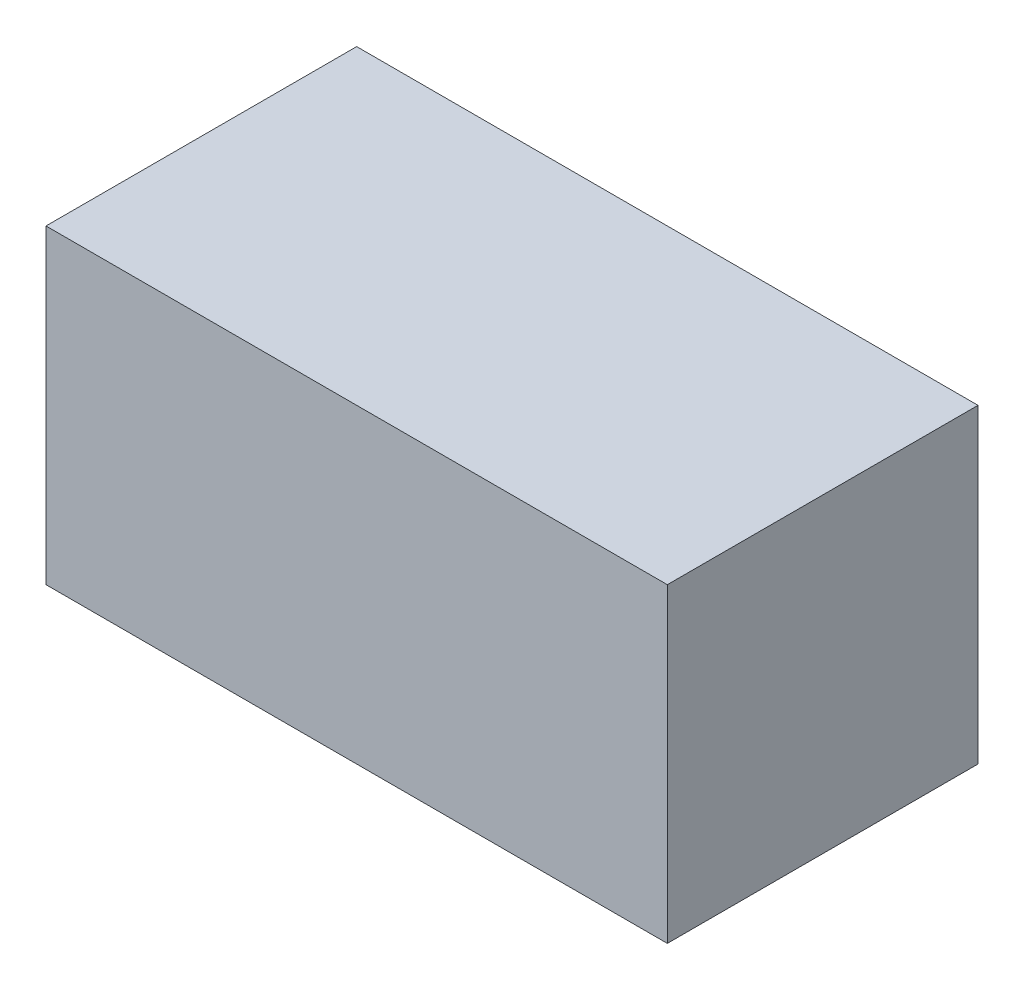
ISO-10303-21;
HEADER;
FILE_DESCRIPTION(('STEP AP214'),'2;1');
FILE_NAME('part.step','',(''),(''),'','','');
FILE_SCHEMA(('AUTOMOTIVE_DESIGN { 1 0 10303 214 1 1 1 1 }'));
ENDSEC;
DATA;
#1=APPLICATION_CONTEXT('core data for automotive mechanical design processes');
#2=APPLICATION_PROTOCOL_DEFINITION('international standard','automotive_design',2000,#1);
#3=PRODUCT_CONTEXT('',#1,'mechanical');
#4=PRODUCT('Part','Part','',(#3));
#5=PRODUCT_RELATED_PRODUCT_CATEGORY('part','',(#4));
#6=PRODUCT_DEFINITION_FORMATION('','',#4);
#7=PRODUCT_DEFINITION_CONTEXT('part definition',#1,'design');
#8=PRODUCT_DEFINITION('design','',#6,#7);
#9=PRODUCT_DEFINITION_SHAPE('','',#8);
#10=(LENGTH_UNIT() NAMED_UNIT(*) SI_UNIT(.MILLI.,.METRE.));
#11=(NAMED_UNIT(*) PLANE_ANGLE_UNIT() SI_UNIT($,.RADIAN.));
#12=(NAMED_UNIT(*) SI_UNIT($,.STERADIAN.) SOLID_ANGLE_UNIT());
#13=UNCERTAINTY_MEASURE_WITH_UNIT(LENGTH_MEASURE(1.E-05),#10,'distance_accuracy_value','');
#14=(GEOMETRIC_REPRESENTATION_CONTEXT(3) GLOBAL_UNCERTAINTY_ASSIGNED_CONTEXT((#13)) GLOBAL_UNIT_ASSIGNED_CONTEXT((#10,
#11,#12)) REPRESENTATION_CONTEXT('',''));
#15=CARTESIAN_POINT('',(0.,0.,0.));
#16=DIRECTION('',(0.,0.,1.));
#17=DIRECTION('',(1.,0.,0.));
#18=AXIS2_PLACEMENT_3D('',#15,#16,#17);
#19=CARTESIAN_POINT('',(0.,0.,10.));
#20=DIRECTION('',(0.,1.,0.));
#21=DIRECTION('',(0.,0.,1.));
#22=AXIS2_PLACEMENT_3D('',#19,#20,#21);
#23=PLANE('',#22);
#24=DIRECTION('',(1.,0.,0.));
#25=VECTOR('',#24,1.);
#26=CARTESIAN_POINT('',(0.,0.,0.));
#27=LINE('',#26,#25);
#28=CARTESIAN_POINT('',(20.,0.,0.));
#29=VERTEX_POINT('',#28);
#30=CARTESIAN_POINT('',(40.,0.,0.));
#31=VERTEX_POINT('',#30);
#32=EDGE_CURVE('E106',#29,#31,#27,.T.);
#33=ORIENTED_EDGE('',*,*,#32,.T.);
#34=DIRECTION('',(0.,0.,-1.));
#35=VECTOR('',#34,1.);
#36=CARTESIAN_POINT('',(40.,0.,10.));
#37=LINE('',#36,#35);
#38=CARTESIAN_POINT('',(40.,0.,10.));
#39=VERTEX_POINT('',#38);
#40=EDGE_CURVE('E11',#39,#31,#37,.T.);
#41=ORIENTED_EDGE('',*,*,#40,.F.);
#42=DIRECTION('',(1.,0.,0.));
#43=VECTOR('',#42,1.);
#44=CARTESIAN_POINT('',(0.,0.,10.));
#45=LINE('',#44,#43);
#46=CARTESIAN_POINT('',(20.,0.,10.));
#47=VERTEX_POINT('',#46);
#48=EDGE_CURVE('E95',#47,#39,#45,.T.);
#49=ORIENTED_EDGE('',*,*,#48,.F.);
#50=DIRECTION('',(0.,0.,-1.));
#51=VECTOR('',#50,1.);
#52=CARTESIAN_POINT('',(20.,0.,10.));
#53=LINE('',#52,#51);
#54=EDGE_CURVE('E56',#47,#29,#53,.T.);
#55=ORIENTED_EDGE('',*,*,#54,.T.);
#56=EDGE_LOOP('',(#33,#41,#49,#55));
#57=FACE_BOUND('',#56,.T.);
#58=ADVANCED_FACE('F43',(#57),#23,.F.);
#59=CARTESIAN_POINT('',(40.,0.,10.));
#60=DIRECTION('',(-1.,0.,0.));
#61=DIRECTION('',(0.,0.,1.));
#62=AXIS2_PLACEMENT_3D('',#59,#60,#61);
#63=PLANE('',#62);
#64=DIRECTION('',(0.,1.,0.));
#65=VECTOR('',#64,1.);
#66=CARTESIAN_POINT('',(40.,0.,0.));
#67=LINE('',#66,#65);
#68=CARTESIAN_POINT('',(40.,10.,0.));
#69=VERTEX_POINT('',#68);
#70=EDGE_CURVE('E100',#31,#69,#67,.T.);
#71=ORIENTED_EDGE('',*,*,#70,.T.);
#72=DIRECTION('',(0.,0.,-1.));
#73=VECTOR('',#72,1.);
#74=CARTESIAN_POINT('',(40.,10.,10.));
#75=LINE('',#74,#73);
#76=CARTESIAN_POINT('',(40.,10.,10.));
#77=VERTEX_POINT('',#76);
#78=EDGE_CURVE('E51',#77,#69,#75,.T.);
#79=ORIENTED_EDGE('',*,*,#78,.F.);
#80=DIRECTION('',(0.,1.,0.));
#81=VECTOR('',#80,1.);
#82=CARTESIAN_POINT('',(40.,0.,10.));
#83=LINE('',#82,#81);
#84=EDGE_CURVE('E84',#39,#77,#83,.T.);
#85=ORIENTED_EDGE('',*,*,#84,.F.);
#86=ORIENTED_EDGE('',*,*,#40,.T.);
#87=EDGE_LOOP('',(#71,#79,#85,#86));
#88=FACE_BOUND('',#87,.T.);
#89=ADVANCED_FACE('F96',(#88),#63,.F.);
#90=CARTESIAN_POINT('',(0.,10.,10.));
#91=DIRECTION('',(0.,1.,0.));
#92=DIRECTION('',(0.,0.,1.));
#93=AXIS2_PLACEMENT_3D('',#90,#91,#92);
#94=PLANE('',#93);
#95=DIRECTION('',(1.,0.,0.));
#96=VECTOR('',#95,1.);
#97=CARTESIAN_POINT('',(0.,10.,0.));
#98=LINE('',#97,#96);
#99=CARTESIAN_POINT('',(20.,10.,0.));
#100=VERTEX_POINT('',#99);
#101=EDGE_CURVE('E108',#100,#69,#98,.T.);
#102=ORIENTED_EDGE('',*,*,#101,.F.);
#103=DIRECTION('',(0.,0.,-1.));
#104=VECTOR('',#103,1.);
#105=CARTESIAN_POINT('',(20.,10.,10.));
#106=LINE('',#105,#104);
#107=CARTESIAN_POINT('',(20.,10.,10.));
#108=VERTEX_POINT('',#107);
#109=EDGE_CURVE('E71',#108,#100,#106,.T.);
#110=ORIENTED_EDGE('',*,*,#109,.F.);
#111=DIRECTION('',(1.,0.,0.));
#112=VECTOR('',#111,1.);
#113=CARTESIAN_POINT('',(0.,10.,10.));
#114=LINE('',#113,#112);
#115=EDGE_CURVE('E93',#108,#77,#114,.T.);
#116=ORIENTED_EDGE('',*,*,#115,.T.);
#117=ORIENTED_EDGE('',*,*,#78,.T.);
#118=EDGE_LOOP('',(#102,#110,#116,#117));
#119=FACE_BOUND('',#118,.T.);
#120=ADVANCED_FACE('F99',(#119),#94,.T.);
#121=CARTESIAN_POINT('',(20.,0.,10.));
#122=DIRECTION('',(-1.,0.,0.));
#123=DIRECTION('',(0.,0.,1.));
#124=AXIS2_PLACEMENT_3D('',#121,#122,#123);
#125=PLANE('',#124);
#126=DIRECTION('',(0.,1.,0.));
#127=VECTOR('',#126,1.);
#128=CARTESIAN_POINT('',(20.,0.,0.));
#129=LINE('',#128,#127);
#130=EDGE_CURVE('E112',#29,#100,#129,.T.);
#131=ORIENTED_EDGE('',*,*,#130,.F.);
#132=ORIENTED_EDGE('',*,*,#54,.F.);
#133=DIRECTION('',(0.,1.,0.));
#134=VECTOR('',#133,1.);
#135=CARTESIAN_POINT('',(20.,0.,10.));
#136=LINE('',#135,#134);
#137=EDGE_CURVE('E101',#47,#108,#136,.T.);
#138=ORIENTED_EDGE('',*,*,#137,.T.);
#139=ORIENTED_EDGE('',*,*,#109,.T.);
#140=EDGE_LOOP('',(#131,#132,#138,#139));
#141=FACE_BOUND('',#140,.T.);
#142=ADVANCED_FACE('F120',(#141),#125,.T.);
#143=CARTESIAN_POINT('',(0.,0.,10.));
#144=DIRECTION('',(0.,0.,1.));
#145=DIRECTION('',(1.,0.,0.));
#146=AXIS2_PLACEMENT_3D('',#143,#144,#145);
#147=PLANE('',#146);
#148=ORIENTED_EDGE('',*,*,#48,.T.);
#149=ORIENTED_EDGE('',*,*,#84,.T.);
#150=ORIENTED_EDGE('',*,*,#115,.F.);
#151=ORIENTED_EDGE('',*,*,#137,.F.);
#152=EDGE_LOOP('',(#148,#149,#150,#151));
#153=FACE_BOUND('',#152,.T.);
#154=ADVANCED_FACE('F86',(#153),#147,.T.);
#155=CARTESIAN_POINT('',(0.,0.,0.));
#156=DIRECTION('',(0.,0.,1.));
#157=DIRECTION('',(1.,0.,0.));
#158=AXIS2_PLACEMENT_3D('',#155,#156,#157);
#159=PLANE('',#158);
#160=ORIENTED_EDGE('',*,*,#32,.F.);
#161=ORIENTED_EDGE('',*,*,#130,.T.);
#162=ORIENTED_EDGE('',*,*,#101,.T.);
#163=ORIENTED_EDGE('',*,*,#70,.F.);
#164=EDGE_LOOP('',(#160,#161,#162,#163));
#165=FACE_BOUND('',#164,.T.);
#166=ADVANCED_FACE('F116',(#165),#159,.F.);
#167=CLOSED_SHELL('',(#58,#89,#120,#142,#154,#166));
#168=MANIFOLD_SOLID_BREP('B2',#167);
#169=ADVANCED_BREP_SHAPE_REPRESENTATION('',(#18,#168),#14);
#170=SHAPE_DEFINITION_REPRESENTATION(#9,#169);
ENDSEC;
END-ISO-10303-21;
